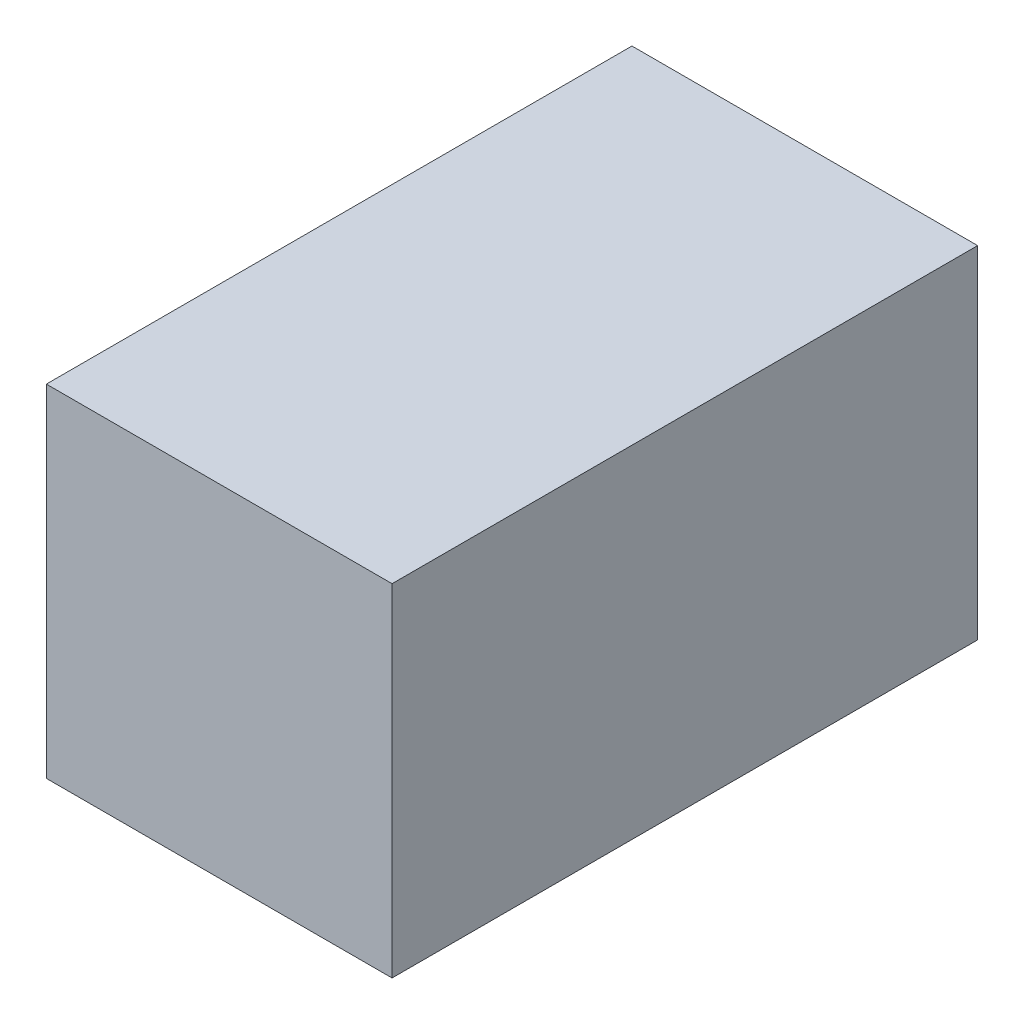
ISO-10303-21;
HEADER;
FILE_DESCRIPTION(('STEP AP214'),'2;1');
FILE_NAME('part.step','',(''),(''),'','','');
FILE_SCHEMA(('AUTOMOTIVE_DESIGN { 1 0 10303 214 1 1 1 1 }'));
ENDSEC;
DATA;
#1=APPLICATION_CONTEXT('core data for automotive mechanical design processes');
#2=APPLICATION_PROTOCOL_DEFINITION('international standard','automotive_design',2000,#1);
#3=PRODUCT_CONTEXT('',#1,'mechanical');
#4=PRODUCT('Part','Part','',(#3));
#5=PRODUCT_RELATED_PRODUCT_CATEGORY('part','',(#4));
#6=PRODUCT_DEFINITION_FORMATION('','',#4);
#7=PRODUCT_DEFINITION_CONTEXT('part definition',#1,'design');
#8=PRODUCT_DEFINITION('design','',#6,#7);
#9=PRODUCT_DEFINITION_SHAPE('','',#8);
#10=(LENGTH_UNIT() NAMED_UNIT(*) SI_UNIT(.MILLI.,.METRE.));
#11=(NAMED_UNIT(*) PLANE_ANGLE_UNIT() SI_UNIT($,.RADIAN.));
#12=(NAMED_UNIT(*) SI_UNIT($,.STERADIAN.) SOLID_ANGLE_UNIT());
#13=UNCERTAINTY_MEASURE_WITH_UNIT(LENGTH_MEASURE(1.E-05),#10,'distance_accuracy_value','');
#14=(GEOMETRIC_REPRESENTATION_CONTEXT(3) GLOBAL_UNCERTAINTY_ASSIGNED_CONTEXT((#13)) GLOBAL_UNIT_ASSIGNED_CONTEXT((#10,
#11,#12)) REPRESENTATION_CONTEXT('',''));
#15=CARTESIAN_POINT('',(0.,0.,0.));
#16=DIRECTION('',(0.,0.,1.));
#17=DIRECTION('',(1.,0.,0.));
#18=AXIS2_PLACEMENT_3D('',#15,#16,#17);
#19=CARTESIAN_POINT('',(36.5125,36.068,123.698));
#20=DIRECTION('',(-1.,0.,0.));
#21=DIRECTION('',(0.,-1.,0.));
#22=AXIS2_PLACEMENT_3D('',#19,#20,#21);
#23=PLANE('',#22);
#24=DIRECTION('',(0.,1.,0.));
#25=VECTOR('',#24,1.);
#26=CARTESIAN_POINT('',(36.5125,36.068,0.));
#27=LINE('',#26,#25);
#28=CARTESIAN_POINT('',(36.5125,-36.068,0.));
#29=VERTEX_POINT('',#28);
#30=CARTESIAN_POINT('',(36.5125,36.068,0.));
#31=VERTEX_POINT('',#30);
#32=EDGE_CURVE('E106',#29,#31,#27,.T.);
#33=ORIENTED_EDGE('',*,*,#32,.T.);
#34=DIRECTION('',(0.,0.,-1.));
#35=VECTOR('',#34,1.);
#36=CARTESIAN_POINT('',(36.5125,36.068,123.698));
#37=LINE('',#36,#35);
#38=CARTESIAN_POINT('',(36.5125,36.068,123.698));
#39=VERTEX_POINT('',#38);
#40=EDGE_CURVE('E11',#39,#31,#37,.T.);
#41=ORIENTED_EDGE('',*,*,#40,.F.);
#42=DIRECTION('',(0.,1.,0.));
#43=VECTOR('',#42,1.);
#44=CARTESIAN_POINT('',(36.5125,36.068,123.698));
#45=LINE('',#44,#43);
#46=CARTESIAN_POINT('',(36.5125,-36.068,123.698));
#47=VERTEX_POINT('',#46);
#48=EDGE_CURVE('E94',#47,#39,#45,.T.);
#49=ORIENTED_EDGE('',*,*,#48,.F.);
#50=DIRECTION('',(0.,0.,-1.));
#51=VECTOR('',#50,1.);
#52=CARTESIAN_POINT('',(36.5125,-36.068,123.698));
#53=LINE('',#52,#51);
#54=EDGE_CURVE('E102',#47,#29,#53,.T.);
#55=ORIENTED_EDGE('',*,*,#54,.T.);
#56=EDGE_LOOP('',(#33,#41,#49,#55));
#57=FACE_BOUND('',#56,.T.);
#58=ADVANCED_FACE('F43',(#57),#23,.F.);
#59=CARTESIAN_POINT('',(-36.5125,36.068,123.698));
#60=DIRECTION('',(0.,-1.,0.));
#61=DIRECTION('',(0.,0.,-1.));
#62=AXIS2_PLACEMENT_3D('',#59,#60,#61);
#63=PLANE('',#62);
#64=DIRECTION('',(-1.,0.,0.));
#65=VECTOR('',#64,1.);
#66=CARTESIAN_POINT('',(-36.5125,36.068,0.));
#67=LINE('',#66,#65);
#68=CARTESIAN_POINT('',(-36.5125,36.068,0.));
#69=VERTEX_POINT('',#68);
#70=EDGE_CURVE('E98',#31,#69,#67,.T.);
#71=ORIENTED_EDGE('',*,*,#70,.T.);
#72=DIRECTION('',(0.,0.,-1.));
#73=VECTOR('',#72,1.);
#74=CARTESIAN_POINT('',(-36.5125,36.068,123.698));
#75=LINE('',#74,#73);
#76=CARTESIAN_POINT('',(-36.5125,36.068,123.698));
#77=VERTEX_POINT('',#76);
#78=EDGE_CURVE('E51',#77,#69,#75,.T.);
#79=ORIENTED_EDGE('',*,*,#78,.F.);
#80=DIRECTION('',(-1.,0.,0.));
#81=VECTOR('',#80,1.);
#82=CARTESIAN_POINT('',(-36.5125,36.068,123.698));
#83=LINE('',#82,#81);
#84=EDGE_CURVE('E89',#39,#77,#83,.T.);
#85=ORIENTED_EDGE('',*,*,#84,.F.);
#86=ORIENTED_EDGE('',*,*,#40,.T.);
#87=EDGE_LOOP('',(#71,#79,#85,#86));
#88=FACE_BOUND('',#87,.T.);
#89=ADVANCED_FACE('F97',(#88),#63,.F.);
#90=CARTESIAN_POINT('',(-36.5125,36.068,123.698));
#91=DIRECTION('',(1.,0.,0.));
#92=DIRECTION('',(0.,1.,0.));
#93=AXIS2_PLACEMENT_3D('',#90,#91,#92);
#94=PLANE('',#93);
#95=DIRECTION('',(0.,-1.,0.));
#96=VECTOR('',#95,1.);
#97=CARTESIAN_POINT('',(-36.5125,36.068,0.));
#98=LINE('',#97,#96);
#99=CARTESIAN_POINT('',(-36.5125,-36.068,0.));
#100=VERTEX_POINT('',#99);
#101=EDGE_CURVE('E76',#69,#100,#98,.T.);
#102=ORIENTED_EDGE('',*,*,#101,.T.);
#103=DIRECTION('',(0.,0.,-1.));
#104=VECTOR('',#103,1.);
#105=CARTESIAN_POINT('',(-36.5125,-36.068,123.698));
#106=LINE('',#105,#104);
#107=CARTESIAN_POINT('',(-36.5125,-36.068,123.698));
#108=VERTEX_POINT('',#107);
#109=EDGE_CURVE('E99',#108,#100,#106,.T.);
#110=ORIENTED_EDGE('',*,*,#109,.F.);
#111=DIRECTION('',(0.,-1.,0.));
#112=VECTOR('',#111,1.);
#113=CARTESIAN_POINT('',(-36.5125,36.068,123.698));
#114=LINE('',#113,#112);
#115=EDGE_CURVE('E92',#77,#108,#114,.T.);
#116=ORIENTED_EDGE('',*,*,#115,.F.);
#117=ORIENTED_EDGE('',*,*,#78,.T.);
#118=EDGE_LOOP('',(#102,#110,#116,#117));
#119=FACE_BOUND('',#118,.T.);
#120=ADVANCED_FACE('F100',(#119),#94,.F.);
#121=CARTESIAN_POINT('',(-36.5125,-36.068,123.698));
#122=DIRECTION('',(0.,1.,0.));
#123=DIRECTION('',(0.,0.,1.));
#124=AXIS2_PLACEMENT_3D('',#121,#122,#123);
#125=PLANE('',#124);
#126=DIRECTION('',(1.,0.,0.));
#127=VECTOR('',#126,1.);
#128=CARTESIAN_POINT('',(-36.5125,-36.068,0.));
#129=LINE('',#128,#127);
#130=EDGE_CURVE('E82',#100,#29,#129,.T.);
#131=ORIENTED_EDGE('',*,*,#130,.T.);
#132=ORIENTED_EDGE('',*,*,#54,.F.);
#133=DIRECTION('',(1.,0.,0.));
#134=VECTOR('',#133,1.);
#135=CARTESIAN_POINT('',(-36.5125,-36.068,123.698));
#136=LINE('',#135,#134);
#137=EDGE_CURVE('E59',#108,#47,#136,.T.);
#138=ORIENTED_EDGE('',*,*,#137,.F.);
#139=ORIENTED_EDGE('',*,*,#109,.T.);
#140=EDGE_LOOP('',(#131,#132,#138,#139));
#141=FACE_BOUND('',#140,.T.);
#142=ADVANCED_FACE('F113',(#141),#125,.F.);
#143=CARTESIAN_POINT('',(0.,0.,123.698));
#144=DIRECTION('',(0.,0.,1.));
#145=DIRECTION('',(1.,0.,0.));
#146=AXIS2_PLACEMENT_3D('',#143,#144,#145);
#147=PLANE('',#146);
#148=ORIENTED_EDGE('',*,*,#48,.T.);
#149=ORIENTED_EDGE('',*,*,#84,.T.);
#150=ORIENTED_EDGE('',*,*,#115,.T.);
#151=ORIENTED_EDGE('',*,*,#137,.T.);
#152=EDGE_LOOP('',(#148,#149,#150,#151));
#153=FACE_BOUND('',#152,.T.);
#154=ADVANCED_FACE('F90',(#153),#147,.T.);
#155=CARTESIAN_POINT('',(0.,0.,0.));
#156=DIRECTION('',(0.,0.,1.));
#157=DIRECTION('',(1.,0.,0.));
#158=AXIS2_PLACEMENT_3D('',#155,#156,#157);
#159=PLANE('',#158);
#160=ORIENTED_EDGE('',*,*,#32,.F.);
#161=ORIENTED_EDGE('',*,*,#130,.F.);
#162=ORIENTED_EDGE('',*,*,#101,.F.);
#163=ORIENTED_EDGE('',*,*,#70,.F.);
#164=EDGE_LOOP('',(#160,#161,#162,#163));
#165=FACE_BOUND('',#164,.T.);
#166=ADVANCED_FACE('F116',(#165),#159,.F.);
#167=CLOSED_SHELL('',(#58,#89,#120,#142,#154,#166));
#168=MANIFOLD_SOLID_BREP('B2',#167);
#169=ADVANCED_BREP_SHAPE_REPRESENTATION('',(#18,#168),#14);
#170=SHAPE_DEFINITION_REPRESENTATION(#9,#169);
ENDSEC;
END-ISO-10303-21;
